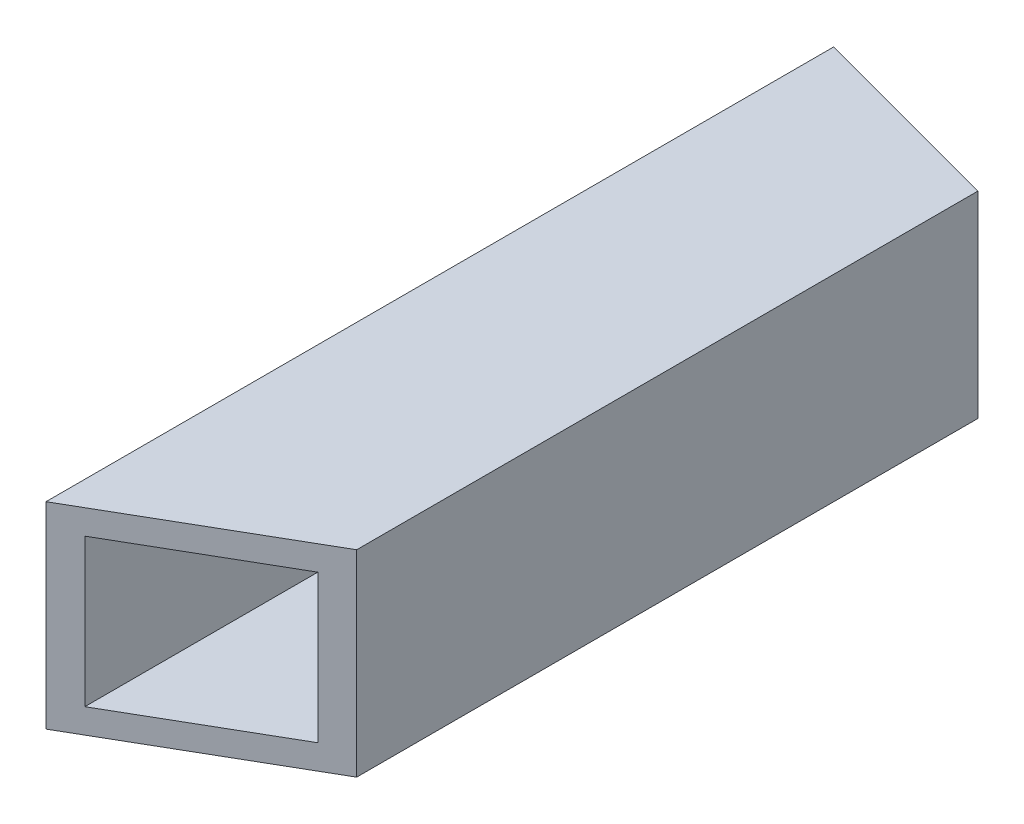
ISO-10303-21;
HEADER;
FILE_DESCRIPTION(('STEP AP214'),'2;1');
FILE_NAME('part.step','',(''),(''),'','','');
FILE_SCHEMA(('AUTOMOTIVE_DESIGN { 1 0 10303 214 1 1 1 1 }'));
ENDSEC;
DATA;
#1=APPLICATION_CONTEXT('core data for automotive mechanical design processes');
#2=APPLICATION_PROTOCOL_DEFINITION('international standard','automotive_design',2000,#1);
#3=PRODUCT_CONTEXT('',#1,'mechanical');
#4=PRODUCT('Part','Part','',(#3));
#5=PRODUCT_RELATED_PRODUCT_CATEGORY('part','',(#4));
#6=PRODUCT_DEFINITION_FORMATION('','',#4);
#7=PRODUCT_DEFINITION_CONTEXT('part definition',#1,'design');
#8=PRODUCT_DEFINITION('design','',#6,#7);
#9=PRODUCT_DEFINITION_SHAPE('','',#8);
#10=(LENGTH_UNIT() NAMED_UNIT(*) SI_UNIT(.MILLI.,.METRE.));
#11=(NAMED_UNIT(*) PLANE_ANGLE_UNIT() SI_UNIT($,.RADIAN.));
#12=(NAMED_UNIT(*) SI_UNIT($,.STERADIAN.) SOLID_ANGLE_UNIT());
#13=UNCERTAINTY_MEASURE_WITH_UNIT(LENGTH_MEASURE(1.E-05),#10,'distance_accuracy_value','');
#14=(GEOMETRIC_REPRESENTATION_CONTEXT(3) GLOBAL_UNCERTAINTY_ASSIGNED_CONTEXT((#13)) GLOBAL_UNIT_ASSIGNED_CONTEXT((#10,
#11,#12)) REPRESENTATION_CONTEXT('',''));
#15=CARTESIAN_POINT('',(0.,0.,0.));
#16=DIRECTION('',(0.,0.,1.));
#17=DIRECTION('',(1.,0.,0.));
#18=AXIS2_PLACEMENT_3D('',#15,#16,#17);
#19=CARTESIAN_POINT('',(-12.7,-12.7,101.6));
#20=DIRECTION('',(1.,0.,0.));
#21=DIRECTION('',(0.,0.,-1.));
#22=AXIS2_PLACEMENT_3D('',#19,#20,#21);
#23=PLANE('',#22);
#24=DIRECTION('',(0.,-1.,0.));
#25=VECTOR('',#24,1.);
#26=CARTESIAN_POINT('',(-12.7,-12.7,0.));
#27=LINE('',#26,#25);
#28=CARTESIAN_POINT('',(-12.7,12.7,0.));
#29=VERTEX_POINT('',#28);
#30=CARTESIAN_POINT('',(-12.7,-12.7,0.));
#31=VERTEX_POINT('',#30);
#32=EDGE_CURVE('E115',#29,#31,#27,.T.);
#33=ORIENTED_EDGE('',*,*,#32,.T.);
#34=DIRECTION('',(0.,0.,-1.));
#35=VECTOR('',#34,1.);
#36=CARTESIAN_POINT('',(-12.7,-12.7,101.6));
#37=LINE('',#36,#35);
#38=CARTESIAN_POINT('',(-12.7,-12.7,101.6));
#39=VERTEX_POINT('',#38);
#40=EDGE_CURVE('E114',#39,#31,#37,.T.);
#41=ORIENTED_EDGE('',*,*,#40,.F.);
#42=DIRECTION('',(0.,-1.,0.));
#43=VECTOR('',#42,1.);
#44=CARTESIAN_POINT('',(-12.7,-12.7,101.6));
#45=LINE('',#44,#43);
#46=CARTESIAN_POINT('',(-12.7,12.7,101.6));
#47=VERTEX_POINT('',#46);
#48=EDGE_CURVE('E96',#47,#39,#45,.T.);
#49=ORIENTED_EDGE('',*,*,#48,.F.);
#50=DIRECTION('',(0.,0.,-1.));
#51=VECTOR('',#50,1.);
#52=CARTESIAN_POINT('',(-12.7,12.7,101.6));
#53=LINE('',#52,#51);
#54=EDGE_CURVE('E104',#47,#29,#53,.T.);
#55=ORIENTED_EDGE('',*,*,#54,.T.);
#56=EDGE_LOOP('',(#33,#41,#49,#55));
#57=FACE_BOUND('',#56,.T.);
#58=ADVANCED_FACE('F32',(#57),#23,.F.);
#59=CARTESIAN_POINT('',(12.7,-12.7,101.6));
#60=DIRECTION('',(0.,1.,0.));
#61=DIRECTION('',(0.,0.,1.));
#62=AXIS2_PLACEMENT_3D('',#59,#60,#61);
#63=PLANE('',#62);
#64=DIRECTION('',(0.,0.,-1.));
#65=VECTOR('',#64,1.);
#66=CARTESIAN_POINT('',(12.7,-12.7,101.6));
#67=LINE('',#66,#65);
#68=CARTESIAN_POINT('',(12.7,-12.7,86.9353031625839));
#69=VERTEX_POINT('',#68);
#70=CARTESIAN_POINT('',(12.7,-12.7,6.80590948775053));
#71=VERTEX_POINT('',#70);
#72=EDGE_CURVE('E123',#69,#71,#67,.T.);
#73=ORIENTED_EDGE('',*,*,#72,.F.);
#74=DIRECTION('',(0.866025403784445,0.,-0.499999999999989));
#75=VECTOR('',#74,1.);
#76=CARTESIAN_POINT('',(12.7,-12.7,86.9353031625839));
#77=LINE('',#76,#75);
#78=EDGE_CURVE('E100',#39,#69,#77,.T.);
#79=ORIENTED_EDGE('',*,*,#78,.F.);
#80=ORIENTED_EDGE('',*,*,#40,.T.);
#81=DIRECTION('',(-0.965925826289068,0.,-0.258819045102521));
#82=VECTOR('',#81,1.);
#83=CARTESIAN_POINT('',(-12.7,-12.7,0.));
#84=LINE('',#83,#82);
#85=EDGE_CURVE('E161',#71,#31,#84,.T.);
#86=ORIENTED_EDGE('',*,*,#85,.F.);
#87=EDGE_LOOP('',(#73,#79,#80,#86));
#88=FACE_BOUND('',#87,.T.);
#89=ADVANCED_FACE('F179',(#88),#63,.F.);
#90=CARTESIAN_POINT('',(12.7,-12.7,101.6));
#91=DIRECTION('',(-1.,0.,0.));
#92=DIRECTION('',(0.,0.,1.));
#93=AXIS2_PLACEMENT_3D('',#90,#91,#92);
#94=PLANE('',#93);
#95=DIRECTION('',(0.,0.,-1.));
#96=VECTOR('',#95,1.);
#97=CARTESIAN_POINT('',(12.7,12.7,101.6));
#98=LINE('',#97,#96);
#99=CARTESIAN_POINT('',(12.7,12.7,86.9353031625839));
#100=VERTEX_POINT('',#99);
#101=CARTESIAN_POINT('',(12.7,12.7,6.80590948775053));
#102=VERTEX_POINT('',#101);
#103=EDGE_CURVE('E110',#100,#102,#98,.T.);
#104=ORIENTED_EDGE('',*,*,#103,.F.);
#105=DIRECTION('',(0.,1.,0.));
#106=VECTOR('',#105,1.);
#107=CARTESIAN_POINT('',(12.7,12.7,86.9353031625839));
#108=LINE('',#107,#106);
#109=EDGE_CURVE('E46',#69,#100,#108,.T.);
#110=ORIENTED_EDGE('',*,*,#109,.F.);
#111=ORIENTED_EDGE('',*,*,#72,.T.);
#112=DIRECTION('',(0.,-1.,0.));
#113=VECTOR('',#112,1.);
#114=CARTESIAN_POINT('',(12.7,-12.7,6.80590948775053));
#115=LINE('',#114,#113);
#116=EDGE_CURVE('E162',#102,#71,#115,.T.);
#117=ORIENTED_EDGE('',*,*,#116,.F.);
#118=EDGE_LOOP('',(#104,#110,#111,#117));
#119=FACE_BOUND('',#118,.T.);
#120=ADVANCED_FACE('F176',(#119),#94,.F.);
#121=CARTESIAN_POINT('',(12.7,12.7,101.6));
#122=DIRECTION('',(0.,-1.,0.));
#123=DIRECTION('',(0.,0.,-1.));
#124=AXIS2_PLACEMENT_3D('',#121,#122,#123);
#125=PLANE('',#124);
#126=ORIENTED_EDGE('',*,*,#54,.F.);
#127=DIRECTION('',(-0.866025403784445,0.,0.499999999999989));
#128=VECTOR('',#127,1.);
#129=CARTESIAN_POINT('',(-12.7,12.7,101.6));
#130=LINE('',#129,#128);
#131=EDGE_CURVE('E92',#100,#47,#130,.T.);
#132=ORIENTED_EDGE('',*,*,#131,.F.);
#133=ORIENTED_EDGE('',*,*,#103,.T.);
#134=DIRECTION('',(0.965925826289068,0.,0.258819045102521));
#135=VECTOR('',#134,1.);
#136=CARTESIAN_POINT('',(12.7,12.7,6.80590948775053));
#137=LINE('',#136,#135);
#138=EDGE_CURVE('E107',#29,#102,#137,.T.);
#139=ORIENTED_EDGE('',*,*,#138,.F.);
#140=EDGE_LOOP('',(#126,#132,#133,#139));
#141=FACE_BOUND('',#140,.T.);
#142=ADVANCED_FACE('F105',(#141),#125,.F.);
#143=CARTESIAN_POINT('',(-9.525,-9.52500000000001,101.6));
#144=DIRECTION('',(1.,0.,0.));
#145=DIRECTION('',(0.,0.,-1.));
#146=AXIS2_PLACEMENT_3D('',#143,#144,#145);
#147=PLANE('',#146);
#148=DIRECTION('',(0.,1.,0.));
#149=VECTOR('',#148,1.);
#150=CARTESIAN_POINT('',(-9.525,-9.52500000000001,99.766912895323));
#151=LINE('',#150,#149);
#152=CARTESIAN_POINT('',(-9.525,-9.52500000000001,99.766912895323));
#153=VERTEX_POINT('',#152);
#154=CARTESIAN_POINT('',(-9.525,9.525,99.766912895323));
#155=VERTEX_POINT('',#154);
#156=EDGE_CURVE('E53',#153,#155,#151,.T.);
#157=ORIENTED_EDGE('',*,*,#156,.F.);
#158=DIRECTION('',(0.,0.,-1.));
#159=VECTOR('',#158,1.);
#160=CARTESIAN_POINT('',(-9.525,-9.52500000000001,101.6));
#161=LINE('',#160,#159);
#162=CARTESIAN_POINT('',(-9.52499999999999,-9.52500000000001,0.850738685968822));
#163=VERTEX_POINT('',#162);
#164=EDGE_CURVE('E117',#153,#163,#161,.T.);
#165=ORIENTED_EDGE('',*,*,#164,.T.);
#166=DIRECTION('',(0.,-1.,0.));
#167=VECTOR('',#166,1.);
#168=CARTESIAN_POINT('',(-9.525,-9.52500000000001,0.850738685968827));
#169=LINE('',#168,#167);
#170=CARTESIAN_POINT('',(-9.52499999999999,9.525,0.850738685968822));
#171=VERTEX_POINT('',#170);
#172=EDGE_CURVE('E134',#171,#163,#169,.T.);
#173=ORIENTED_EDGE('',*,*,#172,.F.);
#174=DIRECTION('',(0.,0.,-1.));
#175=VECTOR('',#174,1.);
#176=CARTESIAN_POINT('',(-9.525,9.525,101.6));
#177=LINE('',#176,#175);
#178=EDGE_CURVE('E143',#155,#171,#177,.T.);
#179=ORIENTED_EDGE('',*,*,#178,.F.);
#180=EDGE_LOOP('',(#157,#165,#173,#179));
#181=FACE_BOUND('',#180,.T.);
#182=ADVANCED_FACE('F142',(#181),#147,.T.);
#183=CARTESIAN_POINT('',(9.525,-9.52500000000001,101.6));
#184=DIRECTION('',(0.,1.,0.));
#185=DIRECTION('',(0.,0.,1.));
#186=AXIS2_PLACEMENT_3D('',#183,#184,#185);
#187=PLANE('',#186);
#188=DIRECTION('',(-0.866025403784445,0.,0.499999999999989));
#189=VECTOR('',#188,1.);
#190=CARTESIAN_POINT('',(3.96875000000023,-9.52500000000001,91.9762927004455));
#191=LINE('',#190,#189);
#192=CARTESIAN_POINT('',(9.525,-9.52500000000001,88.7683902672609));
#193=VERTEX_POINT('',#192);
#194=EDGE_CURVE('E157',#193,#153,#191,.T.);
#195=ORIENTED_EDGE('',*,*,#194,.F.);
#196=DIRECTION('',(0.,0.,-1.));
#197=VECTOR('',#196,1.);
#198=CARTESIAN_POINT('',(9.525,-9.52500000000001,101.6));
#199=LINE('',#198,#197);
#200=CARTESIAN_POINT('',(9.525,-9.52500000000001,5.95517080178172));
#201=VERTEX_POINT('',#200);
#202=EDGE_CURVE('E152',#193,#201,#199,.T.);
#203=ORIENTED_EDGE('',*,*,#202,.T.);
#204=DIRECTION('',(0.965925826289068,0.,0.258819045102521));
#205=VECTOR('',#204,1.);
#206=CARTESIAN_POINT('',(33.4362072995546,-9.52500000000001,12.3621594877506));
#207=LINE('',#206,#205);
#208=EDGE_CURVE('E145',#163,#201,#207,.T.);
#209=ORIENTED_EDGE('',*,*,#208,.F.);
#210=ORIENTED_EDGE('',*,*,#164,.F.);
#211=EDGE_LOOP('',(#195,#203,#209,#210));
#212=FACE_BOUND('',#211,.T.);
#213=ADVANCED_FACE('F156',(#212),#187,.T.);
#214=CARTESIAN_POINT('',(9.525,-9.52500000000001,101.6));
#215=DIRECTION('',(-1.,0.,0.));
#216=DIRECTION('',(0.,0.,1.));
#217=AXIS2_PLACEMENT_3D('',#214,#215,#216);
#218=PLANE('',#217);
#219=DIRECTION('',(0.,-1.,0.));
#220=VECTOR('',#219,1.);
#221=CARTESIAN_POINT('',(9.525,-9.52500000000001,88.7683902672609));
#222=LINE('',#221,#220);
#223=CARTESIAN_POINT('',(9.525,9.525,88.7683902672609));
#224=VERTEX_POINT('',#223);
#225=EDGE_CURVE('E170',#224,#193,#222,.T.);
#226=ORIENTED_EDGE('',*,*,#225,.F.);
#227=DIRECTION('',(0.,0.,-1.));
#228=VECTOR('',#227,1.);
#229=CARTESIAN_POINT('',(9.525,9.525,101.6));
#230=LINE('',#229,#228);
#231=CARTESIAN_POINT('',(9.525,9.525,5.95517080178171));
#232=VERTEX_POINT('',#231);
#233=EDGE_CURVE('E147',#224,#232,#230,.T.);
#234=ORIENTED_EDGE('',*,*,#233,.T.);
#235=DIRECTION('',(0.,1.,0.));
#236=VECTOR('',#235,1.);
#237=CARTESIAN_POINT('',(9.525,-9.52500000000001,5.95517080178172));
#238=LINE('',#237,#236);
#239=EDGE_CURVE('E137',#201,#232,#238,.T.);
#240=ORIENTED_EDGE('',*,*,#239,.F.);
#241=ORIENTED_EDGE('',*,*,#202,.F.);
#242=EDGE_LOOP('',(#226,#234,#240,#241));
#243=FACE_BOUND('',#242,.T.);
#244=ADVANCED_FACE('F160',(#243),#218,.T.);
#245=CARTESIAN_POINT('',(9.525,9.525,101.6));
#246=DIRECTION('',(0.,-1.,0.));
#247=DIRECTION('',(0.,0.,-1.));
#248=AXIS2_PLACEMENT_3D('',#245,#246,#247);
#249=PLANE('',#248);
#250=DIRECTION('',(0.866025403784445,0.,-0.499999999999989));
#251=VECTOR('',#250,1.);
#252=CARTESIAN_POINT('',(3.96875000000023,9.525,91.9762927004455));
#253=LINE('',#252,#251);
#254=EDGE_CURVE('E11',#155,#224,#253,.T.);
#255=ORIENTED_EDGE('',*,*,#254,.F.);
#256=ORIENTED_EDGE('',*,*,#178,.T.);
#257=DIRECTION('',(-0.965925826289068,0.,-0.258819045102521));
#258=VECTOR('',#257,1.);
#259=CARTESIAN_POINT('',(33.4362072995546,9.525,12.3621594877506));
#260=LINE('',#259,#258);
#261=EDGE_CURVE('E39',#232,#171,#260,.T.);
#262=ORIENTED_EDGE('',*,*,#261,.F.);
#263=ORIENTED_EDGE('',*,*,#233,.F.);
#264=EDGE_LOOP('',(#255,#256,#262,#263));
#265=FACE_BOUND('',#264,.T.);
#266=ADVANCED_FACE('F181',(#265),#249,.T.);
#267=CARTESIAN_POINT('',(-0.850738685968818,0.,3.17500000000001));
#268=DIRECTION('',(-0.258819045102521,0.,0.965925826289068));
#269=DIRECTION('',(0.965925826289068,0.,0.258819045102521));
#270=AXIS2_PLACEMENT_3D('',#267,#268,#269);
#271=PLANE('',#270);
#272=ORIENTED_EDGE('',*,*,#172,.T.);
#273=ORIENTED_EDGE('',*,*,#208,.T.);
#274=ORIENTED_EDGE('',*,*,#239,.T.);
#275=ORIENTED_EDGE('',*,*,#261,.T.);
#276=EDGE_LOOP('',(#272,#273,#274,#275));
#277=FACE_BOUND('',#276,.T.);
#278=ORIENTED_EDGE('',*,*,#138,.T.);
#279=ORIENTED_EDGE('',*,*,#116,.T.);
#280=ORIENTED_EDGE('',*,*,#85,.T.);
#281=ORIENTED_EDGE('',*,*,#32,.F.);
#282=EDGE_LOOP('',(#278,#279,#280,#281));
#283=FACE_BOUND('',#282,.T.);
#284=ADVANCED_FACE('F131',(#277,#283),#271,.F.);
#285=CARTESIAN_POINT('',(40.8190905122489,0.,70.70073868597));
#286=DIRECTION('',(-0.499999999999989,0.,-0.866025403784445));
#287=DIRECTION('',(-0.866025403784445,0.,0.499999999999989));
#288=AXIS2_PLACEMENT_3D('',#285,#286,#287);
#289=PLANE('',#288);
#290=ORIENTED_EDGE('',*,*,#156,.T.);
#291=ORIENTED_EDGE('',*,*,#254,.T.);
#292=ORIENTED_EDGE('',*,*,#225,.T.);
#293=ORIENTED_EDGE('',*,*,#194,.T.);
#294=EDGE_LOOP('',(#290,#291,#292,#293));
#295=FACE_BOUND('',#294,.T.);
#296=ORIENTED_EDGE('',*,*,#131,.T.);
#297=ORIENTED_EDGE('',*,*,#48,.T.);
#298=ORIENTED_EDGE('',*,*,#78,.T.);
#299=ORIENTED_EDGE('',*,*,#109,.T.);
#300=EDGE_LOOP('',(#296,#297,#298,#299));
#301=FACE_BOUND('',#300,.T.);
#302=ADVANCED_FACE('F94',(#295,#301),#289,.F.);
#303=CLOSED_SHELL('',(#58,#89,#120,#142,#182,#213,#244,#266,#284,#302));
#304=MANIFOLD_SOLID_BREP('B2',#303);
#305=ADVANCED_BREP_SHAPE_REPRESENTATION('',(#18,#304),#14);
#306=SHAPE_DEFINITION_REPRESENTATION(#9,#305);
ENDSEC;
END-ISO-10303-21;
